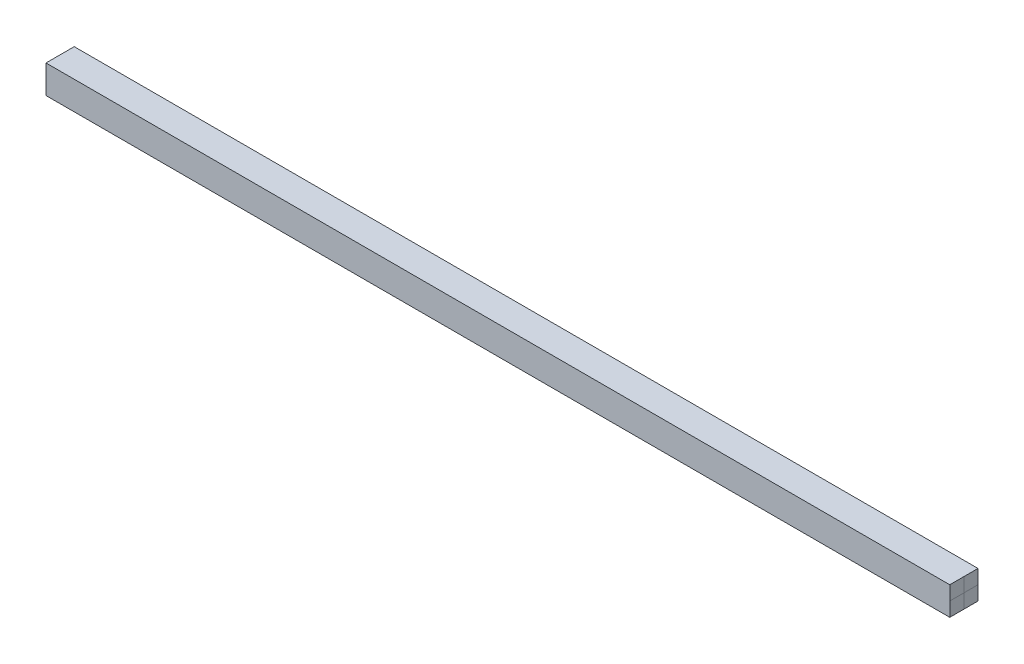
ISO-10303-21;
HEADER;
FILE_DESCRIPTION(('STEP AP214'),'2;1');
FILE_NAME('part.step','',(''),(''),'','','');
FILE_SCHEMA(('AUTOMOTIVE_DESIGN { 1 0 10303 214 1 1 1 1 }'));
ENDSEC;
DATA;
#1=APPLICATION_CONTEXT('core data for automotive mechanical design processes');
#2=APPLICATION_PROTOCOL_DEFINITION('international standard','automotive_design',2000,#1);
#3=PRODUCT_CONTEXT('',#1,'mechanical');
#4=PRODUCT('Part','Part','',(#3));
#5=PRODUCT_RELATED_PRODUCT_CATEGORY('part','',(#4));
#6=PRODUCT_DEFINITION_FORMATION('','',#4);
#7=PRODUCT_DEFINITION_CONTEXT('part definition',#1,'design');
#8=PRODUCT_DEFINITION('design','',#6,#7);
#9=PRODUCT_DEFINITION_SHAPE('','',#8);
#10=(LENGTH_UNIT() NAMED_UNIT(*) SI_UNIT(.MILLI.,.METRE.));
#11=(NAMED_UNIT(*) PLANE_ANGLE_UNIT() SI_UNIT($,.RADIAN.));
#12=(NAMED_UNIT(*) SI_UNIT($,.STERADIAN.) SOLID_ANGLE_UNIT());
#13=UNCERTAINTY_MEASURE_WITH_UNIT(LENGTH_MEASURE(1.E-05),#10,'distance_accuracy_value','');
#14=(GEOMETRIC_REPRESENTATION_CONTEXT(3) GLOBAL_UNCERTAINTY_ASSIGNED_CONTEXT((#13)) GLOBAL_UNIT_ASSIGNED_CONTEXT((#10,
#11,#12)) REPRESENTATION_CONTEXT('',''));
#15=CARTESIAN_POINT('',(0.,0.,0.));
#16=DIRECTION('',(0.,0.,1.));
#17=DIRECTION('',(1.,0.,0.));
#18=AXIS2_PLACEMENT_3D('',#15,#16,#17);
#19=CARTESIAN_POINT('',(3200.,50.,50.));
#20=DIRECTION('',(1.,0.,0.));
#21=DIRECTION('',(0.,0.,-1.));
#22=AXIS2_PLACEMENT_3D('',#19,#20,#21);
#23=PLANE('',#22);
#24=DIRECTION('',(0.,0.,1.));
#25=VECTOR('',#24,1.);
#26=CARTESIAN_POINT('',(3200.,0.,50.));
#27=LINE('',#26,#25);
#28=CARTESIAN_POINT('',(3200.,0.,-50.));
#29=VERTEX_POINT('',#28);
#30=CARTESIAN_POINT('',(3200.,0.,0.));
#31=VERTEX_POINT('',#30);
#32=EDGE_CURVE('E122',#29,#31,#27,.T.);
#33=ORIENTED_EDGE('',*,*,#32,.T.);
#34=DIRECTION('',(0.,-1.,0.));
#35=VECTOR('',#34,1.);
#36=CARTESIAN_POINT('',(3200.,50.,0.));
#37=LINE('',#36,#35);
#38=CARTESIAN_POINT('',(3200.,-50.,0.));
#39=VERTEX_POINT('',#38);
#40=EDGE_CURVE('E11',#31,#39,#37,.T.);
#41=ORIENTED_EDGE('',*,*,#40,.T.);
#42=DIRECTION('',(0.,0.,-1.));
#43=VECTOR('',#42,1.);
#44=CARTESIAN_POINT('',(3200.,-50.,-50.));
#45=LINE('',#44,#43);
#46=CARTESIAN_POINT('',(3200.,-50.,-50.));
#47=VERTEX_POINT('',#46);
#48=EDGE_CURVE('E113',#39,#47,#45,.T.);
#49=ORIENTED_EDGE('',*,*,#48,.T.);
#50=DIRECTION('',(0.,1.,0.));
#51=VECTOR('',#50,1.);
#52=CARTESIAN_POINT('',(3200.,-50.,-50.));
#53=LINE('',#52,#51);
#54=EDGE_CURVE('E145',#47,#29,#53,.T.);
#55=ORIENTED_EDGE('',*,*,#54,.T.);
#56=EDGE_LOOP('',(#33,#41,#49,#55));
#57=FACE_BOUND('',#56,.T.);
#58=ADVANCED_FACE('F40',(#57),#23,.T.);
#59=DIRECTION('',(0.,0.,1.));
#60=VECTOR('',#59,1.);
#61=CARTESIAN_POINT('',(3200.,50.,-50.));
#62=LINE('',#61,#60);
#63=CARTESIAN_POINT('',(3200.,50.,-50.));
#64=VERTEX_POINT('',#63);
#65=CARTESIAN_POINT('',(3200.,50.,0.));
#66=VERTEX_POINT('',#65);
#67=EDGE_CURVE('E140',#64,#66,#62,.T.);
#68=ORIENTED_EDGE('',*,*,#67,.T.);
#69=DIRECTION('',(0.,-1.,0.));
#70=VECTOR('',#69,1.);
#71=CARTESIAN_POINT('',(3200.,50.,0.));
#72=LINE('',#71,#70);
#73=EDGE_CURVE('E44',#66,#31,#72,.T.);
#74=ORIENTED_EDGE('',*,*,#73,.T.);
#75=ORIENTED_EDGE('',*,*,#32,.F.);
#76=EDGE_CURVE('E114',#29,#64,#53,.T.);
#77=ORIENTED_EDGE('',*,*,#76,.T.);
#78=EDGE_LOOP('',(#68,#74,#75,#77));
#79=FACE_BOUND('',#78,.T.);
#80=ADVANCED_FACE('F137',(#79),#23,.T.);
#81=ORIENTED_EDGE('',*,*,#40,.F.);
#82=CARTESIAN_POINT('',(3200.,0.,50.));
#83=VERTEX_POINT('',#82);
#84=EDGE_CURVE('E99',#31,#83,#27,.T.);
#85=ORIENTED_EDGE('',*,*,#84,.T.);
#86=DIRECTION('',(0.,-1.,0.));
#87=VECTOR('',#86,1.);
#88=CARTESIAN_POINT('',(3200.,-50.,50.));
#89=LINE('',#88,#87);
#90=CARTESIAN_POINT('',(3200.,-50.,50.));
#91=VERTEX_POINT('',#90);
#92=EDGE_CURVE('E95',#83,#91,#89,.T.);
#93=ORIENTED_EDGE('',*,*,#92,.T.);
#94=EDGE_CURVE('E98',#91,#39,#45,.T.);
#95=ORIENTED_EDGE('',*,*,#94,.T.);
#96=EDGE_LOOP('',(#81,#85,#93,#95));
#97=FACE_BOUND('',#96,.T.);
#98=ADVANCED_FACE('F97',(#97),#23,.T.);
#99=CARTESIAN_POINT('',(3200.,-50.,50.));
#100=DIRECTION('',(0.,0.,-1.));
#101=DIRECTION('',(-1.,0.,0.));
#102=AXIS2_PLACEMENT_3D('',#99,#100,#101);
#103=PLANE('',#102);
#104=DIRECTION('',(0.,-1.,0.));
#105=VECTOR('',#104,1.);
#106=CARTESIAN_POINT('',(0.,-50.,50.));
#107=LINE('',#106,#105);
#108=CARTESIAN_POINT('',(0.,50.,50.));
#109=VERTEX_POINT('',#108);
#110=CARTESIAN_POINT('',(0.,-50.,50.));
#111=VERTEX_POINT('',#110);
#112=EDGE_CURVE('E118',#109,#111,#107,.T.);
#113=ORIENTED_EDGE('',*,*,#112,.T.);
#114=DIRECTION('',(-1.,0.,0.));
#115=VECTOR('',#114,1.);
#116=CARTESIAN_POINT('',(3200.,-50.,50.));
#117=LINE('',#116,#115);
#118=EDGE_CURVE('E110',#91,#111,#117,.T.);
#119=ORIENTED_EDGE('',*,*,#118,.F.);
#120=ORIENTED_EDGE('',*,*,#92,.F.);
#121=CARTESIAN_POINT('',(3200.,50.,50.));
#122=VERTEX_POINT('',#121);
#123=EDGE_CURVE('E104',#122,#83,#89,.T.);
#124=ORIENTED_EDGE('',*,*,#123,.F.);
#125=DIRECTION('',(-1.,0.,0.));
#126=VECTOR('',#125,1.);
#127=CARTESIAN_POINT('',(3200.,50.,50.));
#128=LINE('',#127,#126);
#129=EDGE_CURVE('E148',#122,#109,#128,.T.);
#130=ORIENTED_EDGE('',*,*,#129,.T.);
#131=EDGE_LOOP('',(#113,#119,#120,#124,#130));
#132=FACE_BOUND('',#131,.T.);
#133=ADVANCED_FACE('F42',(#132),#103,.F.);
#134=CARTESIAN_POINT('',(3200.,-50.,-50.));
#135=DIRECTION('',(0.,1.,0.));
#136=DIRECTION('',(0.,0.,1.));
#137=AXIS2_PLACEMENT_3D('',#134,#135,#136);
#138=PLANE('',#137);
#139=DIRECTION('',(0.,0.,-1.));
#140=VECTOR('',#139,1.);
#141=CARTESIAN_POINT('',(0.,-50.,-50.));
#142=LINE('',#141,#140);
#143=CARTESIAN_POINT('',(0.,-50.,-50.));
#144=VERTEX_POINT('',#143);
#145=EDGE_CURVE('E150',#111,#144,#142,.T.);
#146=ORIENTED_EDGE('',*,*,#145,.T.);
#147=DIRECTION('',(-1.,0.,0.));
#148=VECTOR('',#147,1.);
#149=CARTESIAN_POINT('',(3200.,-50.,-50.));
#150=LINE('',#149,#148);
#151=EDGE_CURVE('E119',#47,#144,#150,.T.);
#152=ORIENTED_EDGE('',*,*,#151,.F.);
#153=ORIENTED_EDGE('',*,*,#48,.F.);
#154=ORIENTED_EDGE('',*,*,#94,.F.);
#155=ORIENTED_EDGE('',*,*,#118,.T.);
#156=EDGE_LOOP('',(#146,#152,#153,#154,#155));
#157=FACE_BOUND('',#156,.T.);
#158=ADVANCED_FACE('F109',(#157),#138,.F.);
#159=CARTESIAN_POINT('',(3200.,-50.,-50.));
#160=DIRECTION('',(0.,0.,1.));
#161=DIRECTION('',(1.,0.,0.));
#162=AXIS2_PLACEMENT_3D('',#159,#160,#161);
#163=PLANE('',#162);
#164=DIRECTION('',(0.,1.,0.));
#165=VECTOR('',#164,1.);
#166=CARTESIAN_POINT('',(0.,-50.,-50.));
#167=LINE('',#166,#165);
#168=CARTESIAN_POINT('',(0.,50.,-50.));
#169=VERTEX_POINT('',#168);
#170=EDGE_CURVE('E152',#144,#169,#167,.T.);
#171=ORIENTED_EDGE('',*,*,#170,.T.);
#172=DIRECTION('',(-1.,0.,0.));
#173=VECTOR('',#172,1.);
#174=CARTESIAN_POINT('',(3200.,50.,-50.));
#175=LINE('',#174,#173);
#176=EDGE_CURVE('E125',#64,#169,#175,.T.);
#177=ORIENTED_EDGE('',*,*,#176,.F.);
#178=ORIENTED_EDGE('',*,*,#76,.F.);
#179=ORIENTED_EDGE('',*,*,#54,.F.);
#180=ORIENTED_EDGE('',*,*,#151,.T.);
#181=EDGE_LOOP('',(#171,#177,#178,#179,#180));
#182=FACE_BOUND('',#181,.T.);
#183=ADVANCED_FACE('F165',(#182),#163,.F.);
#184=CARTESIAN_POINT('',(3200.,50.,-50.));
#185=DIRECTION('',(0.,-1.,0.));
#186=DIRECTION('',(0.,0.,-1.));
#187=AXIS2_PLACEMENT_3D('',#184,#185,#186);
#188=PLANE('',#187);
#189=DIRECTION('',(0.,0.,1.));
#190=VECTOR('',#189,1.);
#191=CARTESIAN_POINT('',(0.,50.,-50.));
#192=LINE('',#191,#190);
#193=EDGE_CURVE('E105',#169,#109,#192,.T.);
#194=ORIENTED_EDGE('',*,*,#193,.T.);
#195=ORIENTED_EDGE('',*,*,#129,.F.);
#196=EDGE_CURVE('E142',#66,#122,#62,.T.);
#197=ORIENTED_EDGE('',*,*,#196,.F.);
#198=ORIENTED_EDGE('',*,*,#67,.F.);
#199=ORIENTED_EDGE('',*,*,#176,.T.);
#200=EDGE_LOOP('',(#194,#195,#197,#198,#199));
#201=FACE_BOUND('',#200,.T.);
#202=ADVANCED_FACE('F159',(#201),#188,.F.);
#203=ORIENTED_EDGE('',*,*,#73,.F.);
#204=ORIENTED_EDGE('',*,*,#196,.T.);
#205=ORIENTED_EDGE('',*,*,#123,.T.);
#206=ORIENTED_EDGE('',*,*,#84,.F.);
#207=EDGE_LOOP('',(#203,#204,#205,#206));
#208=FACE_BOUND('',#207,.T.);
#209=ADVANCED_FACE('F141',(#208),#23,.T.);
#210=CARTESIAN_POINT('',(0.,50.,50.));
#211=DIRECTION('',(1.,0.,0.));
#212=DIRECTION('',(0.,0.,-1.));
#213=AXIS2_PLACEMENT_3D('',#210,#211,#212);
#214=PLANE('',#213);
#215=ORIENTED_EDGE('',*,*,#112,.F.);
#216=ORIENTED_EDGE('',*,*,#193,.F.);
#217=ORIENTED_EDGE('',*,*,#170,.F.);
#218=ORIENTED_EDGE('',*,*,#145,.F.);
#219=EDGE_LOOP('',(#215,#216,#217,#218));
#220=FACE_BOUND('',#219,.T.);
#221=ADVANCED_FACE('F163',(#220),#214,.F.);
#222=CLOSED_SHELL('',(#58,#80,#98,#133,#158,#183,#202,#209,#221));
#223=MANIFOLD_SOLID_BREP('B2',#222);
#224=ADVANCED_BREP_SHAPE_REPRESENTATION('',(#18,#223),#14);
#225=SHAPE_DEFINITION_REPRESENTATION(#9,#224);
ENDSEC;
END-ISO-10303-21;
